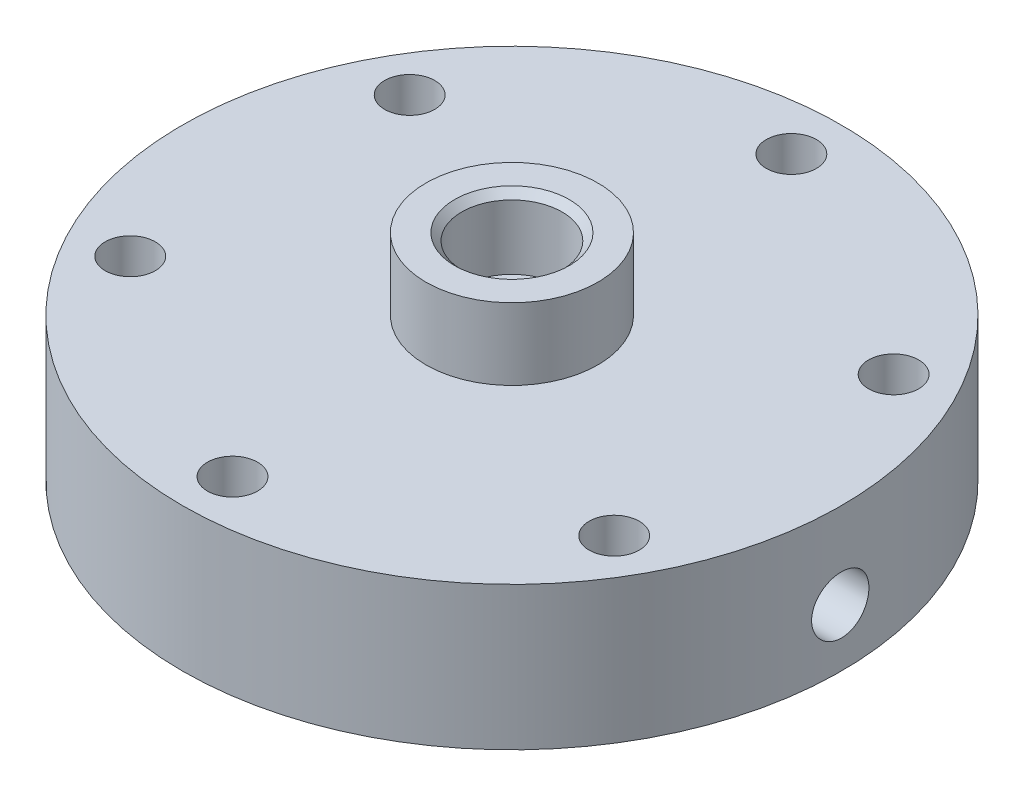
ISO-10303-21;
HEADER;
FILE_DESCRIPTION(('STEP AP214'),'2;1');
FILE_NAME('part.step','',(''),(''),'','','');
FILE_SCHEMA(('AUTOMOTIVE_DESIGN { 1 0 10303 214 1 1 1 1 }'));
ENDSEC;
DATA;
#1=APPLICATION_CONTEXT('core data for automotive mechanical design processes');
#2=APPLICATION_PROTOCOL_DEFINITION('international standard','automotive_design',2000,#1);
#3=PRODUCT_CONTEXT('',#1,'mechanical');
#4=PRODUCT('Part','Part','',(#3));
#5=PRODUCT_RELATED_PRODUCT_CATEGORY('part','',(#4));
#6=PRODUCT_DEFINITION_FORMATION('','',#4);
#7=PRODUCT_DEFINITION_CONTEXT('part definition',#1,'design');
#8=PRODUCT_DEFINITION('design','',#6,#7);
#9=PRODUCT_DEFINITION_SHAPE('','',#8);
#10=(LENGTH_UNIT() NAMED_UNIT(*) SI_UNIT(.MILLI.,.METRE.));
#11=(NAMED_UNIT(*) PLANE_ANGLE_UNIT() SI_UNIT($,.RADIAN.));
#12=(NAMED_UNIT(*) SI_UNIT($,.STERADIAN.) SOLID_ANGLE_UNIT());
#13=UNCERTAINTY_MEASURE_WITH_UNIT(LENGTH_MEASURE(1.E-05),#10,'distance_accuracy_value','');
#14=(GEOMETRIC_REPRESENTATION_CONTEXT(3) GLOBAL_UNCERTAINTY_ASSIGNED_CONTEXT((#13)) GLOBAL_UNIT_ASSIGNED_CONTEXT((#10,
#11,#12)) REPRESENTATION_CONTEXT('',''));
#15=CARTESIAN_POINT('',(0.,0.,0.));
#16=DIRECTION('',(0.,0.,1.));
#17=DIRECTION('',(1.,0.,0.));
#18=AXIS2_PLACEMENT_3D('',#15,#16,#17);
#19=CARTESIAN_POINT('',(0.,20.,0.));
#20=DIRECTION('',(0.,-1.,0.));
#21=DIRECTION('',(0.,0.,-1.));
#22=AXIS2_PLACEMENT_3D('',#19,#20,#21);
#23=CYLINDRICAL_SURFACE('',#22,46.);
#24=CARTESIAN_POINT('',(0.,20.,0.));
#25=DIRECTION('',(0.,1.,0.));
#26=DIRECTION('',(0.,0.,1.));
#27=AXIS2_PLACEMENT_3D('',#24,#25,#26);
#28=CIRCLE('',#27,46.);
#29=CARTESIAN_POINT('',(0.,20.,46.));
#30=VERTEX_POINT('',#29);
#31=EDGE_CURVE('E59',#30,#30,#28,.T.);
#32=ORIENTED_EDGE('',*,*,#31,.F.);
#33=EDGE_LOOP('',(#32));
#34=FACE_BOUND('',#33,.T.);
#35=CARTESIAN_POINT('',(0.,0.,0.));
#36=DIRECTION('',(0.,1.,0.));
#37=DIRECTION('',(0.,0.,1.));
#38=AXIS2_PLACEMENT_3D('',#35,#36,#37);
#39=CIRCLE('',#38,46.);
#40=CARTESIAN_POINT('',(0.,0.,46.));
#41=VERTEX_POINT('',#40);
#42=EDGE_CURVE('E62',#41,#41,#39,.T.);
#43=ORIENTED_EDGE('',*,*,#42,.T.);
#44=EDGE_LOOP('',(#43));
#45=FACE_BOUND('',#44,.T.);
#46=CARTESIAN_POINT('',(46.,4.,0.));
#47=CARTESIAN_POINT('',(45.9999977285705,4.00000977767558,-0.224227383894109));
#48=CARTESIAN_POINT('',(45.9983430362557,4.01891765184624,-0.448606525183141));
#49=CARTESIAN_POINT('',(45.9919012379841,4.094065072974,-0.891154156323271));
#50=CARTESIAN_POINT('',(45.9871106030481,4.15034667884991,-1.10931535995352));
#51=CARTESIAN_POINT('',(45.9749381658736,4.29859949987995,-1.53295378380859));
#52=CARTESIAN_POINT('',(45.9675578500262,4.39055024531742,-1.73843820070689));
#53=CARTESIAN_POINT('',(45.9510332255131,4.60749393271544,-2.13100809888229));
#54=CARTESIAN_POINT('',(45.9418892889027,4.73247990758485,-2.31809744825638));
#55=CARTESIAN_POINT('',(45.9228348976703,5.0123182801845,-2.66913129878992));
#56=CARTESIAN_POINT('',(45.9129226200477,5.16724309709402,-2.83301797480505));
#57=CARTESIAN_POINT('',(45.8934639727461,5.50240802458864,-3.13249799915954));
#58=CARTESIAN_POINT('',(45.883917619324,5.68264925824924,-3.26809009164363));
#59=CARTESIAN_POINT('',(45.8662523263715,6.06368350351458,-3.50732983244712));
#60=CARTESIAN_POINT('',(45.8581356821084,6.2645087579517,-3.61092631199781));
#61=CARTESIAN_POINT('',(45.8442700926442,6.68078588519783,-3.78290727978104));
#62=CARTESIAN_POINT('',(45.8385211022726,6.89623747887064,-3.85129243978993));
#63=CARTESIAN_POINT('',(45.830057344427,7.33506953277857,-3.95074097738121));
#64=CARTESIAN_POINT('',(45.8273348860433,7.55842840039361,-3.98189897039565));
#65=CARTESIAN_POINT('',(45.8252082353394,8.00722090759731,-4.00630104440279));
#66=CARTESIAN_POINT('',(45.8258039757165,8.23265450501178,-3.99954589438519));
#67=CARTESIAN_POINT('',(45.8302394140666,8.67854807492503,-3.9483915880778));
#68=CARTESIAN_POINT('',(45.8340702424775,8.8990199557931,-3.90409535607296));
#69=CARTESIAN_POINT('',(45.8445303189289,9.32938773230792,-3.77927624600677));
#70=CARTESIAN_POINT('',(45.8511595964273,9.53928351659897,-3.69875298659973));
#71=CARTESIAN_POINT('',(45.866479827065,9.94286835048831,-3.50365067255338));
#72=CARTESIAN_POINT('',(45.8751735661868,10.136535016963,-3.38902554426596));
#73=CARTESIAN_POINT('',(45.8936406284605,10.5019193213975,-3.12900647092458));
#74=CARTESIAN_POINT('',(45.9034139754438,10.6736364746627,-2.98361184659911));
#75=CARTESIAN_POINT('',(45.9229785147518,10.9908457111766,-2.66560421524801));
#76=CARTESIAN_POINT('',(45.9327696582409,11.1362486274573,-2.4929022472207));
#77=CARTESIAN_POINT('',(45.95123564835,11.3960121724796,-2.12549237013379));
#78=CARTESIAN_POINT('',(45.959910494134,11.5103727779739,-1.93078444459427));
#79=CARTESIAN_POINT('',(45.9751683502548,11.704800271593,-1.52483096588586));
#80=CARTESIAN_POINT('',(45.9817511125928,11.7848630943976,-1.31358345578605));
#81=CARTESIAN_POINT('',(45.9920803344126,11.9083593146094,-0.880574461427625));
#82=CARTESIAN_POINT('',(45.995826857993,11.9517935398213,-0.658813214898612));
#83=CARTESIAN_POINT('',(46.0000532442106,12.0006875643246,-0.211844479152891));
#84=CARTESIAN_POINT('',(46.0005436994455,12.006270502174,0.0133494440173113));
#85=CARTESIAN_POINT('',(45.9982310016282,11.9796262226001,0.461469996673724));
#86=CARTESIAN_POINT('',(45.9954278820702,11.9473993896855,0.684396649193819));
#87=CARTESIAN_POINT('',(45.9868500316988,11.8461524512686,1.12130261089923));
#88=CARTESIAN_POINT('',(45.9810799206281,11.777189539549,1.33529527230571));
#89=CARTESIAN_POINT('',(45.967216103292,11.6044865363973,1.74867267660003));
#90=CARTESIAN_POINT('',(45.9591223571432,11.5007458480247,1.94805716867549));
#91=CARTESIAN_POINT('',(45.9414917704405,11.261123482931,2.32711808841676));
#92=CARTESIAN_POINT('',(45.9319512956969,11.1251603650181,2.50674286157891));
#93=CARTESIAN_POINT('',(45.9125109361372,10.8250701030327,2.84066374135941));
#94=CARTESIAN_POINT('',(45.9026110445232,10.6609424260434,2.99495936860324));
#95=CARTESIAN_POINT('',(45.8835361672919,10.3086470829359,3.27426550151283));
#96=CARTESIAN_POINT('',(45.8743632176725,10.1204155095944,3.39919555788598));
#97=CARTESIAN_POINT('',(45.8578101371487,9.7255730943939,3.61567234236893));
#98=CARTESIAN_POINT('',(45.8504299869865,9.51896244999095,3.70721942907557));
#99=CARTESIAN_POINT('',(45.8383098416306,9.09350985635044,3.85419502490978));
#100=CARTESIAN_POINT('',(45.8335662683104,8.87468492952759,3.90967250193944));
#101=CARTESIAN_POINT('',(45.8272445862578,8.43078296645951,3.98309339935581));
#102=CARTESIAN_POINT('',(45.825666410717,8.20570606226926,4.00103761191455));
#103=CARTESIAN_POINT('',(45.8258552825946,7.7564887632843,3.99887309501891));
#104=CARTESIAN_POINT('',(45.8276112185648,7.53234774397545,3.97889076180226));
#105=CARTESIAN_POINT('',(45.834246839158,7.09061829859628,3.90170423350695));
#106=CARTESIAN_POINT('',(45.8391265283207,6.87302988204917,3.84449998433456));
#107=CARTESIAN_POINT('',(45.8514568827458,6.45057585402429,3.69452606310882));
#108=CARTESIAN_POINT('',(45.8589073615243,6.24570932097893,3.6017589707124));
#109=CARTESIAN_POINT('',(45.8755401471554,5.85443688157736,3.38330655214035));
#110=CARTESIAN_POINT('',(45.8847224303796,5.66803072340356,3.25762167508082));
#111=CARTESIAN_POINT('',(45.9038206784499,5.31832322639036,2.97642627183586));
#112=CARTESIAN_POINT('',(45.9137388879215,5.15509740320765,2.82082198308656));
#113=CARTESIAN_POINT('',(45.93317092391,4.85701131433315,2.48437904881077));
#114=CARTESIAN_POINT('',(45.9426846522082,4.72215790716712,2.303534319391));
#115=CARTESIAN_POINT('',(45.9602544666636,4.48444685001922,1.92136583977714));
#116=CARTESIAN_POINT('',(45.9683076119567,4.38165345959633,1.72000201971635));
#117=CARTESIAN_POINT('',(45.9820150223571,4.21146917389082,1.30293824908928));
#118=CARTESIAN_POINT('',(45.9876720328809,4.1440377407665,1.08725503492918));
#119=CARTESIAN_POINT('',(45.994503746574,4.06359259940162,0.725257992711601));
#120=CARTESIAN_POINT('',(45.9965554127388,4.03977724903366,0.581269530602114));
#121=CARTESIAN_POINT('',(45.9993042759584,4.00797779362126,0.291542097632155));
#122=CARTESIAN_POINT('',(46.0000014769897,3.99999364209805,0.145803131912245));
#123=CARTESIAN_POINT('',(46.,4.,0.));
#124=B_SPLINE_CURVE_WITH_KNOTS('',3,(#46,#47,#48,#49,#50,#51,#52,#53,#54,#55,#56,#57,#58,#59,
#60,#61,#62,#63,#64,#65,#66,#67,#68,#69,#70,#71,#72,#73,#74,#75,#76,#77,#78,#79,#80,#81,#82,#83,
#84,#85,#86,#87,#88,#89,#90,#91,#92,#93,#94,#95,#96,#97,#98,#99,#100,#101,#102,#103,#104,#105,
#106,#107,#108,#109,#110,#111,#112,#113,#114,#115,#116,#117,#118,#119,#120,#121,#122,#123),
.UNSPECIFIED.,.T.,.F.,(4,2,2,2,2,2,2,2,2,2,2,2,2,2,2,2,2,2,2,2,2,2,2,2,2,2,2,2,2,2,2,2,2,2,2,2,
2,2,4),(0.,0.672149795371173,1.34505728632151,2.01757918073403,2.68995935408334,
3.36398678235651,4.03804412098098,4.71317392514569,5.38829084842311,6.06168824011353,
6.73507197338011,7.40661547829384,8.07816605241073,8.75062808366532,9.42310496183092,
10.0978195498406,10.7725346431367,11.4473296883784,12.1221094828746,12.7946930125715,
13.4672697024505,14.1388023163357,14.8103464572807,15.4836063550193,16.1568789932759,
16.8319751599037,17.507064074496,18.1812345677475,18.855390831904,19.5273043074988,
20.1992187595716,20.8710844815444,21.5429410373477,22.2169384480893,22.8910985989687,
23.5666014469276,24.2413282173606,24.6783927333046,25.11545596607),.UNSPECIFIED.);
#125=CARTESIAN_POINT('',(46.,4.,0.));
#126=VERTEX_POINT('',#125);
#127=EDGE_CURVE('E124',#126,#126,#124,.T.);
#128=ORIENTED_EDGE('',*,*,#127,.F.);
#129=EDGE_LOOP('',(#128));
#130=FACE_BOUND('',#129,.T.);
#131=ADVANCED_FACE('F41',(#34,#45,#130),#23,.T.);
#132=CARTESIAN_POINT('',(0.,14.,0.));
#133=DIRECTION('',(0.,-1.,0.));
#134=DIRECTION('',(0.,0.,-1.));
#135=AXIS2_PLACEMENT_3D('',#132,#133,#134);
#136=CYLINDRICAL_SURFACE('',#135,33.);
#137=CARTESIAN_POINT('',(0.,14.,0.));
#138=DIRECTION('',(0.,-1.,0.));
#139=DIRECTION('',(0.,0.,-1.));
#140=AXIS2_PLACEMENT_3D('',#137,#138,#139);
#141=CIRCLE('',#140,33.);
#142=CARTESIAN_POINT('',(0.,14.,-33.));
#143=VERTEX_POINT('',#142);
#144=EDGE_CURVE('E107',#143,#143,#141,.T.);
#145=ORIENTED_EDGE('',*,*,#144,.F.);
#146=EDGE_LOOP('',(#145));
#147=FACE_BOUND('',#146,.T.);
#148=CARTESIAN_POINT('',(0.,0.,0.));
#149=DIRECTION('',(0.,-1.,0.));
#150=DIRECTION('',(0.,0.,-1.));
#151=AXIS2_PLACEMENT_3D('',#148,#149,#150);
#152=CIRCLE('',#151,33.);
#153=CARTESIAN_POINT('',(0.,0.,-33.));
#154=VERTEX_POINT('',#153);
#155=EDGE_CURVE('E110',#154,#154,#152,.T.);
#156=ORIENTED_EDGE('',*,*,#155,.T.);
#157=EDGE_LOOP('',(#156));
#158=FACE_BOUND('',#157,.T.);
#159=CARTESIAN_POINT('',(32.7566787083184,8.,4.));
#160=CARTESIAN_POINT('',(32.7566818366577,8.22379449651927,3.99999045298508));
#161=CARTESIAN_POINT('',(32.7589969177124,8.44773021035809,3.98115515343243));
#162=CARTESIAN_POINT('',(32.7680039727008,8.889373365523,3.90631302023377));
#163=CARTESIAN_POINT('',(32.7747005616006,9.10707398689689,3.85026699225597));
#164=CARTESIAN_POINT('',(32.7917012296198,9.52978851419071,3.70267655289125));
#165=CARTESIAN_POINT('',(32.8020029032309,9.73481077272732,3.61115580778966));
#166=CARTESIAN_POINT('',(32.8250500965597,10.126547201995,3.39526371924446));
#167=CARTESIAN_POINT('',(32.8377951872424,10.3132645781591,3.27089814151645));
#168=CARTESIAN_POINT('',(32.864368406131,10.6641144539865,2.99214417405283));
#169=CARTESIAN_POINT('',(32.8782013482531,10.8281365492641,2.83761726919589));
#170=CARTESIAN_POINT('',(32.905348295857,11.127986665219,2.50322501027308));
#171=CARTESIAN_POINT('',(32.9186622758482,11.2638133023978,2.32335841356232));
#172=CARTESIAN_POINT('',(32.9433202079721,11.5038108864133,1.94270104483964));
#173=CARTESIAN_POINT('',(32.9546579142429,11.6078822238784,1.74184703190994));
#174=CARTESIAN_POINT('',(32.9740330113373,11.7807771367326,1.325352481192));
#175=CARTESIAN_POINT('',(32.9820705176523,11.8496019456042,1.10971246115218));
#176=CARTESIAN_POINT('',(32.993905717215,11.9497211000787,0.670894532630864));
#177=CARTESIAN_POINT('',(32.9977241084167,11.9811987186027,0.447759006205902));
#178=CARTESIAN_POINT('',(33.0007614848467,12.0062977980333,-0.000657902440336723));
#179=CARTESIAN_POINT('',(32.9999806408196,11.9999206642805,-0.225939204690659));
#180=CARTESIAN_POINT('',(32.9939243045577,11.949638451385,-0.671006287963217));
#181=CARTESIAN_POINT('',(32.9886724189773,11.9059304714488,-0.890814702972183));
#182=CARTESIAN_POINT('',(32.974290708158,11.7825352080508,-1.31995337515371));
#183=CARTESIAN_POINT('',(32.9651608129403,11.7028472753272,-1.52928344316775));
#184=CARTESIAN_POINT('',(32.9440083562255,11.5095434798085,-1.93213533023985));
#185=CARTESIAN_POINT('',(32.931978510434,11.3958420033639,-2.12561567058178));
#186=CARTESIAN_POINT('',(32.9063727008439,11.1378009464467,-2.49082341217299));
#187=CARTESIAN_POINT('',(32.8927966703688,10.9934600444738,-2.66254987465172));
#188=CARTESIAN_POINT('',(32.8655155228159,10.6771327598167,-2.98053255244169));
#189=CARTESIAN_POINT('',(32.8518101368879,10.5049746541673,-3.12661796887099));
#190=CARTESIAN_POINT('',(32.8259012315593,10.1384907062635,-3.38784512845958));
#191=CARTESIAN_POINT('',(32.8136977163744,9.9441648017874,-3.50298678476122));
#192=CARTESIAN_POINT('',(32.7921742461928,9.5387127347217,-3.69906598308285));
#193=CARTESIAN_POINT('',(32.7828554012633,9.32758014384369,-3.77999036212115));
#194=CARTESIAN_POINT('',(32.7681782798095,8.89458469521924,-3.90518910413138));
#195=CARTESIAN_POINT('',(32.762819824179,8.67272232320457,-3.94946512451534));
#196=CARTESIAN_POINT('',(32.7567026814491,8.22607215318564,-3.99988519584663));
#197=CARTESIAN_POINT('',(32.7559150285832,8.00131184385607,-4.00626937814872));
#198=CARTESIAN_POINT('',(32.7589520971464,7.55392484932071,-3.98135765376567));
#199=CARTESIAN_POINT('',(32.7627767262732,7.33129812150695,-3.95006250113017));
#200=CARTESIAN_POINT('',(32.7745810041736,6.89521419985763,-3.85088243715065));
#201=CARTESIAN_POINT('',(32.7825474977128,6.68173027716842,-3.78311334910617));
#202=CARTESIAN_POINT('',(32.8017272208065,6.26915668890473,-3.6130281927127));
#203=CARTESIAN_POINT('',(32.8129405579643,6.07006750065879,-3.51071097938724));
#204=CARTESIAN_POINT('',(32.8374200222184,5.69084701770273,-3.27384173326402));
#205=CARTESIAN_POINT('',(32.8506960788503,5.51081490615677,-3.13913195401655));
#206=CARTESIAN_POINT('',(32.8777737228222,5.17582999170711,-2.84152499642419));
#207=CARTESIAN_POINT('',(32.8915753293471,5.02087810543773,-2.67862678829609));
#208=CARTESIAN_POINT('',(32.9182377149735,4.73961116971855,-2.32821925622029));
#209=CARTESIAN_POINT('',(32.931093067008,4.61345372359441,-2.1405829546922));
#210=CARTESIAN_POINT('',(32.9543337105298,4.39444633148219,-1.74664463837715));
#211=CARTESIAN_POINT('',(32.9647190492445,4.30159574863799,-1.54034298058246));
#212=CARTESIAN_POINT('',(32.9818253693875,4.15209915484651,-1.11545816602638));
#213=CARTESIAN_POINT('',(32.98855563168,4.09536138361741,-0.896907684380683));
#214=CARTESIAN_POINT('',(32.9976319498885,4.0194023139405,-0.453295431839336));
#215=CARTESIAN_POINT('',(32.9999781911159,4.00017942974683,-0.228233936570891));
#216=CARTESIAN_POINT('',(33.000021367475,3.99982420871652,0.220471313794806));
#217=CARTESIAN_POINT('',(32.9977479977708,4.01844858720769,0.444114912587442));
#218=CARTESIAN_POINT('',(32.9888663257534,4.0927447933209,0.885069092955427));
#219=CARTESIAN_POINT('',(32.9822580252319,4.14841660563101,1.10237967714821));
#220=CARTESIAN_POINT('',(32.9654458725196,4.29515239763123,1.5244721638081));
#221=CARTESIAN_POINT('',(32.9552431301393,4.38620545399445,1.72925791053233));
#222=CARTESIAN_POINT('',(32.9323730883384,4.60109385860996,2.12068092912073));
#223=CARTESIAN_POINT('',(32.9197057667317,4.72492950197568,2.30731803758764));
#224=CARTESIAN_POINT('',(32.8932241859913,5.0027703589899,2.65838965314681));
#225=CARTESIAN_POINT('',(32.8794033429218,5.15695670285065,2.82268032326465));
#226=CARTESIAN_POINT('',(32.8522257784064,5.49074781671624,3.12315293120787));
#227=CARTESIAN_POINT('',(32.8388691678779,5.67035860998341,3.25932818941034));
#228=CARTESIAN_POINT('',(32.8140805805222,6.05064490506674,3.50012370208704));
#229=CARTESIAN_POINT('',(32.8026557772711,6.25139461410864,3.60462743792878));
#230=CARTESIAN_POINT('',(32.7831085801835,6.66761744458094,3.77829295203558));
#231=CARTESIAN_POINT('',(32.7749825744407,6.88307415937034,3.84749340586574));
#232=CARTESIAN_POINT('',(32.7649388059801,7.2497201316593,3.93190579331955));
#233=CARTESIAN_POINT('',(32.7618565652437,7.39859108355957,3.9574047064634));
#234=CARTESIAN_POINT('',(32.7577254688871,7.69828663429389,3.99145496920686));
#235=CARTESIAN_POINT('',(32.7566765991008,7.84911121950999,4.00000643687607));
#236=CARTESIAN_POINT('',(32.7566787083184,8.,4.));
#237=B_SPLINE_CURVE_WITH_KNOTS('',3,(#159,#160,#161,#162,#163,#164,#165,#166,#167,#168,#169,
#170,#171,#172,#173,#174,#175,#176,#177,#178,#179,#180,#181,#182,#183,#184,#185,#186,#187,#188,
#189,#190,#191,#192,#193,#194,#195,#196,#197,#198,#199,#200,#201,#202,#203,#204,#205,#206,#207,
#208,#209,#210,#211,#212,#213,#214,#215,#216,#217,#218,#219,#220,#221,#222,#223,#224,#225,#226,
#227,#228,#229,#230,#231,#232,#233,#234,#235,#236),.UNSPECIFIED.,.T.,.F.,(4,2,2,2,2,2,2,2,2,2,2,
2,2,2,2,2,2,2,2,2,2,2,2,2,2,2,2,2,2,2,2,2,2,2,2,2,2,2,4),(0.,0.67083230252087,1.34237232097104,
2.01346510316178,2.68444015720846,3.35857240178021,4.03273771695039,4.70899650098513,
5.38523161715035,6.05813435270303,6.73101210720266,7.40035901245526,8.06971799662072,
8.74077617066324,9.41186329380664,10.087263693043,10.762665988076,11.4383278665181,
12.1139591866663,12.7853042281999,13.4566358348076,14.1258480927268,14.7950825315168,
15.467644495884,16.140231035558,16.8164150504307,17.4925861353889,18.1670321819991,
18.8414497193086,19.5115457711023,20.1816415459413,20.8515306048434,21.5214256943855,
22.1954469793233,22.8696282135606,23.5462604462507,24.2221498121776,24.6744476783457,
25.1267423934303),.UNSPECIFIED.);
#238=CARTESIAN_POINT('',(32.7566787083184,8.,4.));
#239=VERTEX_POINT('',#238);
#240=EDGE_CURVE('E46',#239,#239,#237,.T.);
#241=ORIENTED_EDGE('',*,*,#240,.F.);
#242=EDGE_LOOP('',(#241));
#243=FACE_BOUND('',#242,.T.);
#244=ADVANCED_FACE('F153',(#147,#158,#243),#136,.F.);
#245=CARTESIAN_POINT('',(0.,20.,0.));
#246=DIRECTION('',(0.,1.,0.));
#247=DIRECTION('',(0.,0.,1.));
#248=AXIS2_PLACEMENT_3D('',#245,#246,#247);
#249=PLANE('',#248);
#250=CARTESIAN_POINT('',(0.,20.,0.));
#251=DIRECTION('',(0.,1.,0.));
#252=DIRECTION('',(0.,0.,1.));
#253=AXIS2_PLACEMENT_3D('',#250,#251,#252);
#254=CIRCLE('',#253,12.);
#255=CARTESIAN_POINT('',(0.,20.,12.));
#256=VERTEX_POINT('',#255);
#257=EDGE_CURVE('E104',#256,#256,#254,.T.);
#258=ORIENTED_EDGE('',*,*,#257,.F.);
#259=EDGE_LOOP('',(#258));
#260=FACE_BOUND('',#259,.T.);
#261=CARTESIAN_POINT('',(-33.7749907475915,20.,19.500000000001));
#262=DIRECTION('',(0.,1.,0.));
#263=DIRECTION('',(0.,0.,1.));
#264=AXIS2_PLACEMENT_3D('',#261,#262,#263);
#265=CIRCLE('',#264,3.50000000000221);
#266=CARTESIAN_POINT('',(-33.7749907475915,20.,23.0000000000032));
#267=VERTEX_POINT('',#266);
#268=EDGE_CURVE('E89',#267,#267,#265,.T.);
#269=ORIENTED_EDGE('',*,*,#268,.F.);
#270=EDGE_LOOP('',(#269));
#271=FACE_BOUND('',#270,.T.);
#272=CARTESIAN_POINT('',(33.7749907475948,20.,19.499999999999));
#273=DIRECTION('',(0.,1.,0.));
#274=DIRECTION('',(0.,0.,1.));
#275=AXIS2_PLACEMENT_3D('',#272,#273,#274);
#276=CIRCLE('',#275,3.50000000000148);
#277=CARTESIAN_POINT('',(33.7749907475948,20.,23.0000000000005));
#278=VERTEX_POINT('',#277);
#279=EDGE_CURVE('E77',#278,#278,#276,.T.);
#280=ORIENTED_EDGE('',*,*,#279,.F.);
#281=EDGE_LOOP('',(#280));
#282=FACE_BOUND('',#281,.T.);
#283=CARTESIAN_POINT('',(0.,20.,-39.));
#284=DIRECTION('',(0.,1.,0.));
#285=DIRECTION('',(0.,0.,1.));
#286=AXIS2_PLACEMENT_3D('',#283,#284,#285);
#287=CIRCLE('',#286,3.5);
#288=CARTESIAN_POINT('',(0.,20.,-35.5));
#289=VERTEX_POINT('',#288);
#290=EDGE_CURVE('E65',#289,#289,#287,.T.);
#291=ORIENTED_EDGE('',*,*,#290,.F.);
#292=EDGE_LOOP('',(#291));
#293=FACE_BOUND('',#292,.T.);
#294=ORIENTED_EDGE('',*,*,#31,.T.);
#295=EDGE_LOOP('',(#294));
#296=FACE_BOUND('',#295,.T.);
#297=CARTESIAN_POINT('',(33.7749907475937,20.,-19.500000000001));
#298=DIRECTION('',(0.,1.,0.));
#299=DIRECTION('',(0.,0.,1.));
#300=AXIS2_PLACEMENT_3D('',#297,#298,#299);
#301=CIRCLE('',#300,3.50000000000035);
#302=CARTESIAN_POINT('',(33.7749907475937,20.,-16.0000000000006));
#303=VERTEX_POINT('',#302);
#304=EDGE_CURVE('E71',#303,#303,#301,.T.);
#305=ORIENTED_EDGE('',*,*,#304,.F.);
#306=EDGE_LOOP('',(#305));
#307=FACE_BOUND('',#306,.T.);
#308=CARTESIAN_POINT('',(2.20256496802149E-12,20.,39.));
#309=DIRECTION('',(0.,1.,0.));
#310=DIRECTION('',(0.,0.,1.));
#311=AXIS2_PLACEMENT_3D('',#308,#309,#310);
#312=CIRCLE('',#311,3.50000000000237);
#313=CARTESIAN_POINT('',(2.20256496802149E-12,20.,42.5000000000024));
#314=VERTEX_POINT('',#313);
#315=EDGE_CURVE('E83',#314,#314,#312,.T.);
#316=ORIENTED_EDGE('',*,*,#315,.F.);
#317=EDGE_LOOP('',(#316));
#318=FACE_BOUND('',#317,.T.);
#319=CARTESIAN_POINT('',(-33.7749907475926,20.,-19.499999999999));
#320=DIRECTION('',(0.,1.,0.));
#321=DIRECTION('',(0.,0.,1.));
#322=AXIS2_PLACEMENT_3D('',#319,#320,#321);
#323=CIRCLE('',#322,3.50000000000127);
#324=CARTESIAN_POINT('',(-33.7749907475926,20.,-15.9999999999978));
#325=VERTEX_POINT('',#324);
#326=EDGE_CURVE('E95',#325,#325,#323,.T.);
#327=ORIENTED_EDGE('',*,*,#326,.F.);
#328=EDGE_LOOP('',(#327));
#329=FACE_BOUND('',#328,.T.);
#330=ADVANCED_FACE('F157',(#260,#271,#282,#293,#296,#307,#318,#329),#249,.T.);
#331=CARTESIAN_POINT('',(0.,0.,0.));
#332=DIRECTION('',(0.,1.,0.));
#333=DIRECTION('',(0.,0.,1.));
#334=AXIS2_PLACEMENT_3D('',#331,#332,#333);
#335=PLANE('',#334);
#336=ORIENTED_EDGE('',*,*,#155,.F.);
#337=EDGE_LOOP('',(#336));
#338=FACE_BOUND('',#337,.T.);
#339=ORIENTED_EDGE('',*,*,#42,.F.);
#340=EDGE_LOOP('',(#339));
#341=FACE_BOUND('',#340,.T.);
#342=CARTESIAN_POINT('',(0.,0.,-39.));
#343=DIRECTION('',(0.,1.,0.));
#344=DIRECTION('',(0.,0.,1.));
#345=AXIS2_PLACEMENT_3D('',#342,#343,#344);
#346=CIRCLE('',#345,3.5);
#347=CARTESIAN_POINT('',(0.,0.,-35.5));
#348=VERTEX_POINT('',#347);
#349=EDGE_CURVE('E68',#348,#348,#346,.T.);
#350=ORIENTED_EDGE('',*,*,#349,.T.);
#351=EDGE_LOOP('',(#350));
#352=FACE_BOUND('',#351,.T.);
#353=CARTESIAN_POINT('',(33.7749907475937,0.,-19.500000000001));
#354=DIRECTION('',(0.,1.,0.));
#355=DIRECTION('',(0.,0.,1.));
#356=AXIS2_PLACEMENT_3D('',#353,#354,#355);
#357=CIRCLE('',#356,3.50000000000035);
#358=CARTESIAN_POINT('',(33.7749907475937,0.,-16.0000000000006));
#359=VERTEX_POINT('',#358);
#360=EDGE_CURVE('E74',#359,#359,#357,.T.);
#361=ORIENTED_EDGE('',*,*,#360,.T.);
#362=EDGE_LOOP('',(#361));
#363=FACE_BOUND('',#362,.T.);
#364=CARTESIAN_POINT('',(33.7749907475948,0.,19.499999999999));
#365=DIRECTION('',(0.,1.,0.));
#366=DIRECTION('',(0.,0.,1.));
#367=AXIS2_PLACEMENT_3D('',#364,#365,#366);
#368=CIRCLE('',#367,3.50000000000148);
#369=CARTESIAN_POINT('',(33.7749907475948,0.,23.0000000000005));
#370=VERTEX_POINT('',#369);
#371=EDGE_CURVE('E80',#370,#370,#368,.T.);
#372=ORIENTED_EDGE('',*,*,#371,.T.);
#373=EDGE_LOOP('',(#372));
#374=FACE_BOUND('',#373,.T.);
#375=CARTESIAN_POINT('',(2.20256496802149E-12,0.,39.));
#376=DIRECTION('',(0.,1.,0.));
#377=DIRECTION('',(0.,0.,1.));
#378=AXIS2_PLACEMENT_3D('',#375,#376,#377);
#379=CIRCLE('',#378,3.50000000000237);
#380=CARTESIAN_POINT('',(2.20256496802149E-12,0.,42.5000000000024));
#381=VERTEX_POINT('',#380);
#382=EDGE_CURVE('E86',#381,#381,#379,.T.);
#383=ORIENTED_EDGE('',*,*,#382,.T.);
#384=EDGE_LOOP('',(#383));
#385=FACE_BOUND('',#384,.T.);
#386=CARTESIAN_POINT('',(-33.7749907475915,0.,19.500000000001));
#387=DIRECTION('',(0.,1.,0.));
#388=DIRECTION('',(0.,0.,1.));
#389=AXIS2_PLACEMENT_3D('',#386,#387,#388);
#390=CIRCLE('',#389,3.50000000000221);
#391=CARTESIAN_POINT('',(-33.7749907475915,0.,23.0000000000032));
#392=VERTEX_POINT('',#391);
#393=EDGE_CURVE('E92',#392,#392,#390,.T.);
#394=ORIENTED_EDGE('',*,*,#393,.T.);
#395=EDGE_LOOP('',(#394));
#396=FACE_BOUND('',#395,.T.);
#397=CARTESIAN_POINT('',(-33.7749907475926,0.,-19.499999999999));
#398=DIRECTION('',(0.,1.,0.));
#399=DIRECTION('',(0.,0.,1.));
#400=AXIS2_PLACEMENT_3D('',#397,#398,#399);
#401=CIRCLE('',#400,3.50000000000127);
#402=CARTESIAN_POINT('',(-33.7749907475926,0.,-15.9999999999978));
#403=VERTEX_POINT('',#402);
#404=EDGE_CURVE('E98',#403,#403,#401,.T.);
#405=ORIENTED_EDGE('',*,*,#404,.T.);
#406=EDGE_LOOP('',(#405));
#407=FACE_BOUND('',#406,.T.);
#408=ADVANCED_FACE('F188',(#338,#341,#352,#363,#374,#385,#396,#407),#335,.F.);
#409=CARTESIAN_POINT('',(0.,20.,-39.));
#410=DIRECTION('',(0.,-1.,0.));
#411=DIRECTION('',(0.,0.,-1.));
#412=AXIS2_PLACEMENT_3D('',#409,#410,#411);
#413=CYLINDRICAL_SURFACE('',#412,3.5);
#414=ORIENTED_EDGE('',*,*,#290,.T.);
#415=EDGE_LOOP('',(#414));
#416=FACE_BOUND('',#415,.T.);
#417=ORIENTED_EDGE('',*,*,#349,.F.);
#418=EDGE_LOOP('',(#417));
#419=FACE_BOUND('',#418,.T.);
#420=ADVANCED_FACE('F184',(#416,#419),#413,.F.);
#421=CARTESIAN_POINT('',(33.7749907475937,20.,-19.500000000001));
#422=DIRECTION('',(0.,-1.,0.));
#423=DIRECTION('',(0.,0.,-1.));
#424=AXIS2_PLACEMENT_3D('',#421,#422,#423);
#425=CYLINDRICAL_SURFACE('',#424,3.50000000000035);
#426=ORIENTED_EDGE('',*,*,#304,.T.);
#427=EDGE_LOOP('',(#426));
#428=FACE_BOUND('',#427,.T.);
#429=ORIENTED_EDGE('',*,*,#360,.F.);
#430=EDGE_LOOP('',(#429));
#431=FACE_BOUND('',#430,.T.);
#432=ADVANCED_FACE('F180',(#428,#431),#425,.F.);
#433=CARTESIAN_POINT('',(33.7749907475948,20.,19.499999999999));
#434=DIRECTION('',(0.,-1.,0.));
#435=DIRECTION('',(0.,0.,-1.));
#436=AXIS2_PLACEMENT_3D('',#433,#434,#435);
#437=CYLINDRICAL_SURFACE('',#436,3.50000000000148);
#438=ORIENTED_EDGE('',*,*,#279,.T.);
#439=EDGE_LOOP('',(#438));
#440=FACE_BOUND('',#439,.T.);
#441=ORIENTED_EDGE('',*,*,#371,.F.);
#442=EDGE_LOOP('',(#441));
#443=FACE_BOUND('',#442,.T.);
#444=ADVANCED_FACE('F176',(#440,#443),#437,.F.);
#445=CARTESIAN_POINT('',(2.20256496802149E-12,20.,39.));
#446=DIRECTION('',(0.,-1.,0.));
#447=DIRECTION('',(0.,0.,-1.));
#448=AXIS2_PLACEMENT_3D('',#445,#446,#447);
#449=CYLINDRICAL_SURFACE('',#448,3.50000000000237);
#450=ORIENTED_EDGE('',*,*,#315,.T.);
#451=EDGE_LOOP('',(#450));
#452=FACE_BOUND('',#451,.T.);
#453=ORIENTED_EDGE('',*,*,#382,.F.);
#454=EDGE_LOOP('',(#453));
#455=FACE_BOUND('',#454,.T.);
#456=ADVANCED_FACE('F172',(#452,#455),#449,.F.);
#457=CARTESIAN_POINT('',(-33.7749907475915,20.,19.500000000001));
#458=DIRECTION('',(0.,-1.,0.));
#459=DIRECTION('',(0.,0.,-1.));
#460=AXIS2_PLACEMENT_3D('',#457,#458,#459);
#461=CYLINDRICAL_SURFACE('',#460,3.50000000000221);
#462=ORIENTED_EDGE('',*,*,#268,.T.);
#463=EDGE_LOOP('',(#462));
#464=FACE_BOUND('',#463,.T.);
#465=ORIENTED_EDGE('',*,*,#393,.F.);
#466=EDGE_LOOP('',(#465));
#467=FACE_BOUND('',#466,.T.);
#468=ADVANCED_FACE('F168',(#464,#467),#461,.F.);
#469=CARTESIAN_POINT('',(-33.7749907475926,20.,-19.499999999999));
#470=DIRECTION('',(0.,-1.,0.));
#471=DIRECTION('',(0.,0.,-1.));
#472=AXIS2_PLACEMENT_3D('',#469,#470,#471);
#473=CYLINDRICAL_SURFACE('',#472,3.50000000000127);
#474=ORIENTED_EDGE('',*,*,#326,.T.);
#475=EDGE_LOOP('',(#474));
#476=FACE_BOUND('',#475,.T.);
#477=ORIENTED_EDGE('',*,*,#404,.F.);
#478=EDGE_LOOP('',(#477));
#479=FACE_BOUND('',#478,.T.);
#480=ADVANCED_FACE('F164',(#476,#479),#473,.F.);
#481=CARTESIAN_POINT('',(0.,30.,0.));
#482=DIRECTION('',(0.,-1.,0.));
#483=DIRECTION('',(0.,0.,-1.));
#484=AXIS2_PLACEMENT_3D('',#481,#482,#483);
#485=CYLINDRICAL_SURFACE('',#484,12.);
#486=CARTESIAN_POINT('',(0.,30.,0.));
#487=DIRECTION('',(0.,1.,0.));
#488=DIRECTION('',(0.,0.,1.));
#489=AXIS2_PLACEMENT_3D('',#486,#487,#488);
#490=CIRCLE('',#489,12.);
#491=CARTESIAN_POINT('',(0.,30.,12.));
#492=VERTEX_POINT('',#491);
#493=EDGE_CURVE('E101',#492,#492,#490,.T.);
#494=ORIENTED_EDGE('',*,*,#493,.F.);
#495=EDGE_LOOP('',(#494));
#496=FACE_BOUND('',#495,.T.);
#497=ORIENTED_EDGE('',*,*,#257,.T.);
#498=EDGE_LOOP('',(#497));
#499=FACE_BOUND('',#498,.T.);
#500=ADVANCED_FACE('F161',(#496,#499),#485,.T.);
#501=CARTESIAN_POINT('',(0.,30.,0.));
#502=DIRECTION('',(0.,1.,0.));
#503=DIRECTION('',(0.,0.,1.));
#504=AXIS2_PLACEMENT_3D('',#501,#502,#503);
#505=PLANE('',#504);
#506=CARTESIAN_POINT('',(0.,30.,0.));
#507=DIRECTION('',(0.,1.,0.));
#508=DIRECTION('',(0.,0.,1.));
#509=AXIS2_PLACEMENT_3D('',#506,#507,#508);
#510=CIRCLE('',#509,8.00000000000001);
#511=CARTESIAN_POINT('',(0.,30.,8.00000000000001));
#512=VERTEX_POINT('',#511);
#513=EDGE_CURVE('E10',#512,#512,#510,.F.);
#514=ORIENTED_EDGE('',*,*,#513,.T.);
#515=EDGE_LOOP('',(#514));
#516=FACE_BOUND('',#515,.T.);
#517=ORIENTED_EDGE('',*,*,#493,.T.);
#518=EDGE_LOOP('',(#517));
#519=FACE_BOUND('',#518,.T.);
#520=ADVANCED_FACE('F151',(#516,#519),#505,.T.);
#521=CARTESIAN_POINT('',(0.,14.,0.));
#522=DIRECTION('',(0.,-1.,0.));
#523=DIRECTION('',(0.,0.,-1.));
#524=AXIS2_PLACEMENT_3D('',#521,#522,#523);
#525=PLANE('',#524);
#526=CARTESIAN_POINT('',(0.,14.,0.));
#527=DIRECTION('',(0.,-1.,0.));
#528=DIRECTION('',(0.,0.,-1.));
#529=AXIS2_PLACEMENT_3D('',#526,#527,#528);
#530=CIRCLE('',#529,2.5);
#531=CARTESIAN_POINT('',(0.,14.,-2.5));
#532=VERTEX_POINT('',#531);
#533=EDGE_CURVE('E113',#532,#532,#530,.T.);
#534=ORIENTED_EDGE('',*,*,#533,.F.);
#535=EDGE_LOOP('',(#534));
#536=FACE_BOUND('',#535,.T.);
#537=ORIENTED_EDGE('',*,*,#144,.T.);
#538=EDGE_LOOP('',(#537));
#539=FACE_BOUND('',#538,.T.);
#540=ADVANCED_FACE('F148',(#536,#539),#525,.T.);
#541=CARTESIAN_POINT('',(0.,20.,0.));
#542=DIRECTION('',(0.,-1.,0.));
#543=DIRECTION('',(0.,0.,-1.));
#544=AXIS2_PLACEMENT_3D('',#541,#542,#543);
#545=CYLINDRICAL_SURFACE('',#544,2.5);
#546=CARTESIAN_POINT('',(0.,20.,0.));
#547=DIRECTION('',(0.,-1.,0.));
#548=DIRECTION('',(0.,0.,-1.));
#549=AXIS2_PLACEMENT_3D('',#546,#547,#548);
#550=CIRCLE('',#549,2.5);
#551=CARTESIAN_POINT('',(0.,20.,-2.5));
#552=VERTEX_POINT('',#551);
#553=EDGE_CURVE('E118',#552,#552,#550,.T.);
#554=ORIENTED_EDGE('',*,*,#553,.F.);
#555=EDGE_LOOP('',(#554));
#556=FACE_BOUND('',#555,.T.);
#557=ORIENTED_EDGE('',*,*,#533,.T.);
#558=EDGE_LOOP('',(#557));
#559=FACE_BOUND('',#558,.T.);
#560=ADVANCED_FACE('F141',(#556,#559),#545,.F.);
#561=CARTESIAN_POINT('',(0.,20.,0.));
#562=DIRECTION('',(0.,1.,0.));
#563=DIRECTION('',(0.,0.,1.));
#564=AXIS2_PLACEMENT_3D('',#561,#562,#563);
#565=PLANE('',#564);
#566=CARTESIAN_POINT('',(0.,20.,0.));
#567=DIRECTION('',(0.,1.,0.));
#568=DIRECTION('',(0.,0.,1.));
#569=AXIS2_PLACEMENT_3D('',#566,#567,#568);
#570=CIRCLE('',#569,7.);
#571=CARTESIAN_POINT('',(0.,20.,7.));
#572=VERTEX_POINT('',#571);
#573=EDGE_CURVE('E121',#572,#572,#570,.T.);
#574=ORIENTED_EDGE('',*,*,#573,.T.);
#575=EDGE_LOOP('',(#574));
#576=FACE_BOUND('',#575,.T.);
#577=ORIENTED_EDGE('',*,*,#553,.T.);
#578=EDGE_LOOP('',(#577));
#579=FACE_BOUND('',#578,.T.);
#580=ADVANCED_FACE('F136',(#576,#579),#565,.T.);
#581=CARTESIAN_POINT('',(0.,20.,0.));
#582=DIRECTION('',(0.,1.,0.));
#583=DIRECTION('',(0.,0.,1.));
#584=AXIS2_PLACEMENT_3D('',#581,#582,#583);
#585=CYLINDRICAL_SURFACE('',#584,7.);
#586=CARTESIAN_POINT('',(0.,29.,0.));
#587=DIRECTION('',(0.,1.,0.));
#588=DIRECTION('',(0.,0.,1.));
#589=AXIS2_PLACEMENT_3D('',#586,#587,#588);
#590=CIRCLE('',#589,7.);
#591=CARTESIAN_POINT('',(0.,29.,7.));
#592=VERTEX_POINT('',#591);
#593=EDGE_CURVE('E55',#592,#592,#590,.T.);
#594=ORIENTED_EDGE('',*,*,#593,.T.);
#595=EDGE_LOOP('',(#594));
#596=FACE_BOUND('',#595,.T.);
#597=ORIENTED_EDGE('',*,*,#573,.F.);
#598=EDGE_LOOP('',(#597));
#599=FACE_BOUND('',#598,.T.);
#600=ADVANCED_FACE('F140',(#596,#599),#585,.F.);
#601=CARTESIAN_POINT('',(0.,29.,0.));
#602=DIRECTION('',(0.,1.,0.));
#603=DIRECTION('',(0.,0.,1.));
#604=AXIS2_PLACEMENT_3D('',#601,#602,#603);
#605=CONICAL_SURFACE('',#604,7.,0.78539816339745);
#606=ORIENTED_EDGE('',*,*,#513,.F.);
#607=EDGE_LOOP('',(#606));
#608=FACE_BOUND('',#607,.T.);
#609=ORIENTED_EDGE('',*,*,#593,.F.);
#610=EDGE_LOOP('',(#609));
#611=FACE_BOUND('',#610,.T.);
#612=ADVANCED_FACE('F44',(#608,#611),#605,.F.);
#613=CARTESIAN_POINT('',(46.,8.,0.));
#614=DIRECTION('',(-1.,0.,0.));
#615=DIRECTION('',(0.,0.,1.));
#616=AXIS2_PLACEMENT_3D('',#613,#614,#615);
#617=CYLINDRICAL_SURFACE('',#616,4.);
#618=ORIENTED_EDGE('',*,*,#240,.T.);
#619=EDGE_LOOP('',(#618));
#620=FACE_BOUND('',#619,.T.);
#621=ORIENTED_EDGE('',*,*,#127,.T.);
#622=EDGE_LOOP('',(#621));
#623=FACE_BOUND('',#622,.T.);
#624=ADVANCED_FACE('F131',(#620,#623),#617,.F.);
#625=CLOSED_SHELL('',(#131,#244,#330,#408,#420,#432,#444,#456,#468,#480,#500,#520,#540,#560,
#580,#600,#612,#624));
#626=MANIFOLD_SOLID_BREP('B2',#625);
#627=ADVANCED_BREP_SHAPE_REPRESENTATION('',(#18,#626),#14);
#628=SHAPE_DEFINITION_REPRESENTATION(#9,#627);
ENDSEC;
END-ISO-10303-21;
